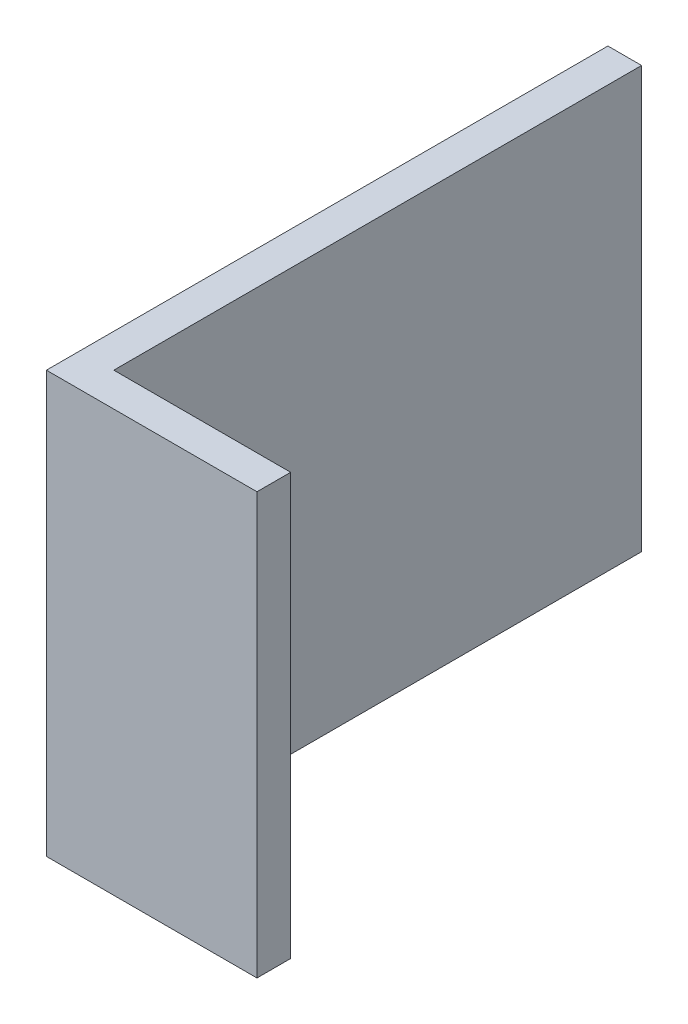
ISO-10303-21;
HEADER;
FILE_DESCRIPTION(('STEP AP214'),'2;1');
FILE_NAME('part.step','',(''),(''),'','','');
FILE_SCHEMA(('AUTOMOTIVE_DESIGN { 1 0 10303 214 1 1 1 1 }'));
ENDSEC;
DATA;
#1=APPLICATION_CONTEXT('core data for automotive mechanical design processes');
#2=APPLICATION_PROTOCOL_DEFINITION('international standard','automotive_design',2000,#1);
#3=PRODUCT_CONTEXT('',#1,'mechanical');
#4=PRODUCT('Part','Part','',(#3));
#5=PRODUCT_RELATED_PRODUCT_CATEGORY('part','',(#4));
#6=PRODUCT_DEFINITION_FORMATION('','',#4);
#7=PRODUCT_DEFINITION_CONTEXT('part definition',#1,'design');
#8=PRODUCT_DEFINITION('design','',#6,#7);
#9=PRODUCT_DEFINITION_SHAPE('','',#8);
#10=(LENGTH_UNIT() NAMED_UNIT(*) SI_UNIT(.MILLI.,.METRE.));
#11=(NAMED_UNIT(*) PLANE_ANGLE_UNIT() SI_UNIT($,.RADIAN.));
#12=(NAMED_UNIT(*) SI_UNIT($,.STERADIAN.) SOLID_ANGLE_UNIT());
#13=UNCERTAINTY_MEASURE_WITH_UNIT(LENGTH_MEASURE(1.E-05),#10,'distance_accuracy_value','');
#14=(GEOMETRIC_REPRESENTATION_CONTEXT(3) GLOBAL_UNCERTAINTY_ASSIGNED_CONTEXT((#13)) GLOBAL_UNIT_ASSIGNED_CONTEXT((#10,
#11,#12)) REPRESENTATION_CONTEXT('',''));
#15=CARTESIAN_POINT('',(0.,0.,0.));
#16=DIRECTION('',(0.,0.,1.));
#17=DIRECTION('',(1.,0.,0.));
#18=AXIS2_PLACEMENT_3D('',#15,#16,#17);
#19=CARTESIAN_POINT('',(3.048,38.1,0.));
#20=DIRECTION('',(-1.,0.,0.));
#21=DIRECTION('',(0.,0.,1.));
#22=AXIS2_PLACEMENT_3D('',#19,#20,#21);
#23=PLANE('',#22);
#24=DIRECTION('',(0.,0.,-1.));
#25=VECTOR('',#24,1.);
#26=CARTESIAN_POINT('',(3.048,0.,0.));
#27=LINE('',#26,#25);
#28=CARTESIAN_POINT('',(3.048,0.,-3.048));
#29=VERTEX_POINT('',#28);
#30=CARTESIAN_POINT('',(3.048,0.,-50.8));
#31=VERTEX_POINT('',#30);
#32=EDGE_CURVE('E125',#29,#31,#27,.T.);
#33=ORIENTED_EDGE('',*,*,#32,.T.);
#34=DIRECTION('',(0.,-1.,0.));
#35=VECTOR('',#34,1.);
#36=CARTESIAN_POINT('',(3.048,38.1,-50.8));
#37=LINE('',#36,#35);
#38=CARTESIAN_POINT('',(3.048,38.1,-50.8));
#39=VERTEX_POINT('',#38);
#40=EDGE_CURVE('E11',#39,#31,#37,.T.);
#41=ORIENTED_EDGE('',*,*,#40,.F.);
#42=DIRECTION('',(0.,0.,-1.));
#43=VECTOR('',#42,1.);
#44=CARTESIAN_POINT('',(3.048,38.1,0.));
#45=LINE('',#44,#43);
#46=CARTESIAN_POINT('',(3.048,38.1,-3.048));
#47=VERTEX_POINT('',#46);
#48=EDGE_CURVE('E86',#47,#39,#45,.T.);
#49=ORIENTED_EDGE('',*,*,#48,.F.);
#50=DIRECTION('',(0.,-1.,0.));
#51=VECTOR('',#50,1.);
#52=CARTESIAN_POINT('',(3.048,38.1,-3.048));
#53=LINE('',#52,#51);
#54=EDGE_CURVE('E121',#47,#29,#53,.T.);
#55=ORIENTED_EDGE('',*,*,#54,.T.);
#56=EDGE_LOOP('',(#33,#41,#49,#55));
#57=FACE_BOUND('',#56,.T.);
#58=ADVANCED_FACE('F39',(#57),#23,.F.);
#59=CARTESIAN_POINT('',(0.,38.1,-50.8));
#60=DIRECTION('',(0.,0.,-1.));
#61=DIRECTION('',(-1.,0.,0.));
#62=AXIS2_PLACEMENT_3D('',#59,#60,#61);
#63=PLANE('',#62);
#64=DIRECTION('',(1.,0.,0.));
#65=VECTOR('',#64,1.);
#66=CARTESIAN_POINT('',(0.,0.,-50.8));
#67=LINE('',#66,#65);
#68=CARTESIAN_POINT('',(0.,0.,-50.8));
#69=VERTEX_POINT('',#68);
#70=EDGE_CURVE('E129',#69,#31,#67,.T.);
#71=ORIENTED_EDGE('',*,*,#70,.F.);
#72=DIRECTION('',(0.,-1.,0.));
#73=VECTOR('',#72,1.);
#74=CARTESIAN_POINT('',(0.,38.1,-50.8));
#75=LINE('',#74,#73);
#76=CARTESIAN_POINT('',(0.,38.1,-50.8));
#77=VERTEX_POINT('',#76);
#78=EDGE_CURVE('E48',#77,#69,#75,.T.);
#79=ORIENTED_EDGE('',*,*,#78,.F.);
#80=DIRECTION('',(1.,0.,0.));
#81=VECTOR('',#80,1.);
#82=CARTESIAN_POINT('',(0.,38.1,-50.8));
#83=LINE('',#82,#81);
#84=EDGE_CURVE('E225',#77,#39,#83,.T.);
#85=ORIENTED_EDGE('',*,*,#84,.T.);
#86=ORIENTED_EDGE('',*,*,#40,.T.);
#87=EDGE_LOOP('',(#71,#79,#85,#86));
#88=FACE_BOUND('',#87,.T.);
#89=ADVANCED_FACE('F156',(#88),#63,.T.);
#90=CARTESIAN_POINT('',(0.,38.1,0.));
#91=DIRECTION('',(-1.,0.,0.));
#92=DIRECTION('',(0.,0.,1.));
#93=AXIS2_PLACEMENT_3D('',#90,#91,#92);
#94=PLANE('',#93);
#95=DIRECTION('',(0.,0.,-1.));
#96=VECTOR('',#95,1.);
#97=CARTESIAN_POINT('',(0.,0.,0.));
#98=LINE('',#97,#96);
#99=CARTESIAN_POINT('',(0.,0.,0.));
#100=VERTEX_POINT('',#99);
#101=EDGE_CURVE('E133',#100,#69,#98,.T.);
#102=ORIENTED_EDGE('',*,*,#101,.F.);
#103=DIRECTION('',(0.,-1.,0.));
#104=VECTOR('',#103,1.);
#105=CARTESIAN_POINT('',(0.,38.1,0.));
#106=LINE('',#105,#104);
#107=CARTESIAN_POINT('',(0.,38.1,0.));
#108=VERTEX_POINT('',#107);
#109=EDGE_CURVE('E108',#108,#100,#106,.T.);
#110=ORIENTED_EDGE('',*,*,#109,.F.);
#111=DIRECTION('',(0.,0.,-1.));
#112=VECTOR('',#111,1.);
#113=CARTESIAN_POINT('',(0.,38.1,0.));
#114=LINE('',#113,#112);
#115=EDGE_CURVE('E114',#108,#77,#114,.T.);
#116=ORIENTED_EDGE('',*,*,#115,.T.);
#117=ORIENTED_EDGE('',*,*,#78,.T.);
#118=EDGE_LOOP('',(#102,#110,#116,#117));
#119=FACE_BOUND('',#118,.T.);
#120=ADVANCED_FACE('F153',(#119),#94,.T.);
#121=CARTESIAN_POINT('',(19.05,38.1,0.));
#122=DIRECTION('',(0.,0.,1.));
#123=DIRECTION('',(1.,0.,0.));
#124=AXIS2_PLACEMENT_3D('',#121,#122,#123);
#125=PLANE('',#124);
#126=DIRECTION('',(-1.,0.,0.));
#127=VECTOR('',#126,1.);
#128=CARTESIAN_POINT('',(19.05,0.,0.));
#129=LINE('',#128,#127);
#130=CARTESIAN_POINT('',(19.05,0.,0.));
#131=VERTEX_POINT('',#130);
#132=EDGE_CURVE('E102',#131,#100,#129,.T.);
#133=ORIENTED_EDGE('',*,*,#132,.F.);
#134=DIRECTION('',(0.,-1.,0.));
#135=VECTOR('',#134,1.);
#136=CARTESIAN_POINT('',(19.05,38.1,0.));
#137=LINE('',#136,#135);
#138=CARTESIAN_POINT('',(19.05,38.1,0.));
#139=VERTEX_POINT('',#138);
#140=EDGE_CURVE('E97',#139,#131,#137,.T.);
#141=ORIENTED_EDGE('',*,*,#140,.F.);
#142=DIRECTION('',(-1.,0.,0.));
#143=VECTOR('',#142,1.);
#144=CARTESIAN_POINT('',(19.05,38.1,0.));
#145=LINE('',#144,#143);
#146=EDGE_CURVE('E100',#139,#108,#145,.T.);
#147=ORIENTED_EDGE('',*,*,#146,.T.);
#148=ORIENTED_EDGE('',*,*,#109,.T.);
#149=EDGE_LOOP('',(#133,#141,#147,#148));
#150=FACE_BOUND('',#149,.T.);
#151=ADVANCED_FACE('F99',(#150),#125,.T.);
#152=CARTESIAN_POINT('',(19.05,38.1,-3.048));
#153=DIRECTION('',(1.,0.,0.));
#154=DIRECTION('',(0.,0.,-1.));
#155=AXIS2_PLACEMENT_3D('',#152,#153,#154);
#156=PLANE('',#155);
#157=DIRECTION('',(0.,0.,1.));
#158=VECTOR('',#157,1.);
#159=CARTESIAN_POINT('',(19.05,0.,-3.048));
#160=LINE('',#159,#158);
#161=CARTESIAN_POINT('',(19.05,0.,-3.048));
#162=VERTEX_POINT('',#161);
#163=EDGE_CURVE('E139',#162,#131,#160,.T.);
#164=ORIENTED_EDGE('',*,*,#163,.F.);
#165=DIRECTION('',(0.,-1.,0.));
#166=VECTOR('',#165,1.);
#167=CARTESIAN_POINT('',(19.05,38.1,-3.048));
#168=LINE('',#167,#166);
#169=CARTESIAN_POINT('',(19.05,38.1,-3.048));
#170=VERTEX_POINT('',#169);
#171=EDGE_CURVE('E77',#170,#162,#168,.T.);
#172=ORIENTED_EDGE('',*,*,#171,.F.);
#173=DIRECTION('',(0.,0.,1.));
#174=VECTOR('',#173,1.);
#175=CARTESIAN_POINT('',(19.05,38.1,-3.048));
#176=LINE('',#175,#174);
#177=EDGE_CURVE('E112',#170,#139,#176,.T.);
#178=ORIENTED_EDGE('',*,*,#177,.T.);
#179=ORIENTED_EDGE('',*,*,#140,.T.);
#180=EDGE_LOOP('',(#164,#172,#178,#179));
#181=FACE_BOUND('',#180,.T.);
#182=ADVANCED_FACE('F117',(#181),#156,.T.);
#183=CARTESIAN_POINT('',(19.05,38.1,-3.048));
#184=DIRECTION('',(0.,0.,1.));
#185=DIRECTION('',(1.,0.,0.));
#186=AXIS2_PLACEMENT_3D('',#183,#184,#185);
#187=PLANE('',#186);
#188=DIRECTION('',(-1.,0.,0.));
#189=VECTOR('',#188,1.);
#190=CARTESIAN_POINT('',(19.05,0.,-3.048));
#191=LINE('',#190,#189);
#192=EDGE_CURVE('E80',#162,#29,#191,.T.);
#193=ORIENTED_EDGE('',*,*,#192,.T.);
#194=ORIENTED_EDGE('',*,*,#54,.F.);
#195=DIRECTION('',(-1.,0.,0.));
#196=VECTOR('',#195,1.);
#197=CARTESIAN_POINT('',(19.05,38.1,-3.048));
#198=LINE('',#197,#196);
#199=EDGE_CURVE('E56',#170,#47,#198,.T.);
#200=ORIENTED_EDGE('',*,*,#199,.F.);
#201=ORIENTED_EDGE('',*,*,#171,.T.);
#202=EDGE_LOOP('',(#193,#194,#200,#201));
#203=FACE_BOUND('',#202,.T.);
#204=ADVANCED_FACE('F161',(#203),#187,.F.);
#205=CARTESIAN_POINT('',(0.,38.1,0.));
#206=DIRECTION('',(0.,-1.,0.));
#207=DIRECTION('',(-1.,0.,0.));
#208=AXIS2_PLACEMENT_3D('',#205,#206,#207);
#209=PLANE('',#208);
#210=ORIENTED_EDGE('',*,*,#48,.T.);
#211=ORIENTED_EDGE('',*,*,#84,.F.);
#212=ORIENTED_EDGE('',*,*,#115,.F.);
#213=ORIENTED_EDGE('',*,*,#146,.F.);
#214=ORIENTED_EDGE('',*,*,#177,.F.);
#215=ORIENTED_EDGE('',*,*,#199,.T.);
#216=EDGE_LOOP('',(#210,#211,#212,#213,#214,#215));
#217=FACE_BOUND('',#216,.T.);
#218=ADVANCED_FACE('F111',(#217),#209,.F.);
#219=CARTESIAN_POINT('',(0.,0.,0.));
#220=DIRECTION('',(0.,-1.,0.));
#221=DIRECTION('',(-1.,0.,0.));
#222=AXIS2_PLACEMENT_3D('',#219,#220,#221);
#223=PLANE('',#222);
#224=ORIENTED_EDGE('',*,*,#32,.F.);
#225=ORIENTED_EDGE('',*,*,#192,.F.);
#226=ORIENTED_EDGE('',*,*,#163,.T.);
#227=ORIENTED_EDGE('',*,*,#132,.T.);
#228=ORIENTED_EDGE('',*,*,#101,.T.);
#229=ORIENTED_EDGE('',*,*,#70,.T.);
#230=EDGE_LOOP('',(#224,#225,#226,#227,#228,#229));
#231=FACE_BOUND('',#230,.T.);
#232=ADVANCED_FACE('F159',(#231),#223,.T.);
#233=CLOSED_SHELL('',(#58,#89,#120,#151,#182,#204,#218,#232));
#234=MANIFOLD_SOLID_BREP('B2',#233);
#235=ADVANCED_BREP_SHAPE_REPRESENTATION('',(#18,#234),#14);
#236=SHAPE_DEFINITION_REPRESENTATION(#9,#235);
ENDSEC;
END-ISO-10303-21;
